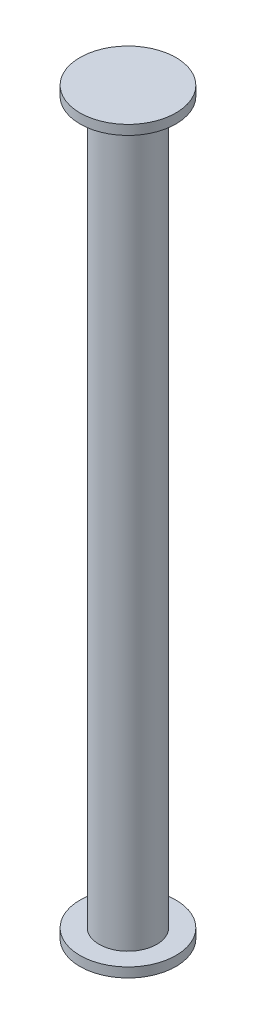
ISO-10303-21;
HEADER;
FILE_DESCRIPTION(('STEP AP214'),'2;1');
FILE_NAME('part.step','',(''),(''),'','','');
FILE_SCHEMA(('AUTOMOTIVE_DESIGN { 1 0 10303 214 1 1 1 1 }'));
ENDSEC;
DATA;
#1=APPLICATION_CONTEXT('core data for automotive mechanical design processes');
#2=APPLICATION_PROTOCOL_DEFINITION('international standard','automotive_design',2000,#1);
#3=PRODUCT_CONTEXT('',#1,'mechanical');
#4=PRODUCT('Part','Part','',(#3));
#5=PRODUCT_RELATED_PRODUCT_CATEGORY('part','',(#4));
#6=PRODUCT_DEFINITION_FORMATION('','',#4);
#7=PRODUCT_DEFINITION_CONTEXT('part definition',#1,'design');
#8=PRODUCT_DEFINITION('design','',#6,#7);
#9=PRODUCT_DEFINITION_SHAPE('','',#8);
#10=(LENGTH_UNIT() NAMED_UNIT(*) SI_UNIT(.MILLI.,.METRE.));
#11=(NAMED_UNIT(*) PLANE_ANGLE_UNIT() SI_UNIT($,.RADIAN.));
#12=(NAMED_UNIT(*) SI_UNIT($,.STERADIAN.) SOLID_ANGLE_UNIT());
#13=UNCERTAINTY_MEASURE_WITH_UNIT(LENGTH_MEASURE(1.E-05),#10,'distance_accuracy_value','');
#14=(GEOMETRIC_REPRESENTATION_CONTEXT(3) GLOBAL_UNCERTAINTY_ASSIGNED_CONTEXT((#13)) GLOBAL_UNIT_ASSIGNED_CONTEXT((#10,
#11,#12)) REPRESENTATION_CONTEXT('',''));
#15=CARTESIAN_POINT('',(0.,0.,0.));
#16=DIRECTION('',(0.,0.,1.));
#17=DIRECTION('',(1.,0.,0.));
#18=AXIS2_PLACEMENT_3D('',#15,#16,#17);
#19=CARTESIAN_POINT('',(0.,0.1,0.));
#20=DIRECTION('',(0.,-1.,0.));
#21=DIRECTION('',(0.,0.,-1.));
#22=AXIS2_PLACEMENT_3D('',#19,#20,#21);
#23=CYLINDRICAL_SURFACE('',#22,0.5);
#24=CARTESIAN_POINT('',(0.,0.1,0.));
#25=DIRECTION('',(0.,1.,0.));
#26=DIRECTION('',(0.,0.,1.));
#27=AXIS2_PLACEMENT_3D('',#24,#25,#26);
#28=CIRCLE('',#27,0.5);
#29=CARTESIAN_POINT('',(0.,0.1,0.5));
#30=VERTEX_POINT('',#29);
#31=EDGE_CURVE('E10',#30,#30,#28,.T.);
#32=ORIENTED_EDGE('',*,*,#31,.F.);
#33=EDGE_LOOP('',(#32));
#34=FACE_BOUND('',#33,.T.);
#35=CARTESIAN_POINT('',(0.,0.,0.));
#36=DIRECTION('',(0.,1.,0.));
#37=DIRECTION('',(0.,0.,1.));
#38=AXIS2_PLACEMENT_3D('',#35,#36,#37);
#39=CIRCLE('',#38,0.5);
#40=CARTESIAN_POINT('',(0.,0.,0.5));
#41=VERTEX_POINT('',#40);
#42=EDGE_CURVE('E34',#41,#41,#39,.T.);
#43=ORIENTED_EDGE('',*,*,#42,.T.);
#44=EDGE_LOOP('',(#43));
#45=FACE_BOUND('',#44,.T.);
#46=ADVANCED_FACE('F31',(#34,#45),#23,.T.);
#47=CARTESIAN_POINT('',(0.,0.1,0.));
#48=DIRECTION('',(0.,1.,0.));
#49=DIRECTION('',(0.,0.,1.));
#50=AXIS2_PLACEMENT_3D('',#47,#48,#49);
#51=PLANE('',#50);
#52=CARTESIAN_POINT('',(0.,0.1,0.));
#53=DIRECTION('',(0.,1.,0.));
#54=DIRECTION('',(0.,0.,1.));
#55=AXIS2_PLACEMENT_3D('',#52,#53,#54);
#56=CIRCLE('',#55,0.3);
#57=CARTESIAN_POINT('',(0.,0.1,0.3));
#58=VERTEX_POINT('',#57);
#59=EDGE_CURVE('E43',#58,#58,#56,.T.);
#60=ORIENTED_EDGE('',*,*,#59,.F.);
#61=EDGE_LOOP('',(#60));
#62=FACE_BOUND('',#61,.T.);
#63=ORIENTED_EDGE('',*,*,#31,.T.);
#64=EDGE_LOOP('',(#63));
#65=FACE_BOUND('',#64,.T.);
#66=ADVANCED_FACE('F73',(#62,#65),#51,.T.);
#67=CARTESIAN_POINT('',(0.,0.,0.));
#68=DIRECTION('',(0.,1.,0.));
#69=DIRECTION('',(0.,0.,1.));
#70=AXIS2_PLACEMENT_3D('',#67,#68,#69);
#71=PLANE('',#70);
#72=ORIENTED_EDGE('',*,*,#42,.F.);
#73=EDGE_LOOP('',(#72));
#74=FACE_BOUND('',#73,.T.);
#75=ADVANCED_FACE('F78',(#74),#71,.F.);
#76=CARTESIAN_POINT('',(0.,7.6,0.));
#77=DIRECTION('',(0.,-1.,0.));
#78=DIRECTION('',(0.,0.,-1.));
#79=AXIS2_PLACEMENT_3D('',#76,#77,#78);
#80=CYLINDRICAL_SURFACE('',#79,0.3);
#81=CARTESIAN_POINT('',(0.,7.6,0.));
#82=DIRECTION('',(0.,1.,0.));
#83=DIRECTION('',(0.,0.,1.));
#84=AXIS2_PLACEMENT_3D('',#81,#82,#83);
#85=CIRCLE('',#84,0.3);
#86=CARTESIAN_POINT('',(0.,7.6,0.3));
#87=VERTEX_POINT('',#86);
#88=EDGE_CURVE('E41',#87,#87,#85,.T.);
#89=ORIENTED_EDGE('',*,*,#88,.F.);
#90=EDGE_LOOP('',(#89));
#91=FACE_BOUND('',#90,.T.);
#92=ORIENTED_EDGE('',*,*,#59,.T.);
#93=EDGE_LOOP('',(#92));
#94=FACE_BOUND('',#93,.T.);
#95=ADVANCED_FACE('F60',(#91,#94),#80,.T.);
#96=CARTESIAN_POINT('',(0.,7.7,0.));
#97=DIRECTION('',(0.,-1.,0.));
#98=DIRECTION('',(0.,0.,-1.));
#99=AXIS2_PLACEMENT_3D('',#96,#97,#98);
#100=CYLINDRICAL_SURFACE('',#99,0.5);
#101=CARTESIAN_POINT('',(0.,7.7,0.));
#102=DIRECTION('',(0.,1.,0.));
#103=DIRECTION('',(0.,0.,1.));
#104=AXIS2_PLACEMENT_3D('',#101,#102,#103);
#105=CIRCLE('',#104,0.5);
#106=CARTESIAN_POINT('',(0.,7.7,0.5));
#107=VERTEX_POINT('',#106);
#108=EDGE_CURVE('E46',#107,#107,#105,.T.);
#109=ORIENTED_EDGE('',*,*,#108,.F.);
#110=EDGE_LOOP('',(#109));
#111=FACE_BOUND('',#110,.T.);
#112=CARTESIAN_POINT('',(0.,7.6,0.));
#113=DIRECTION('',(0.,1.,0.));
#114=DIRECTION('',(0.,0.,1.));
#115=AXIS2_PLACEMENT_3D('',#112,#113,#114);
#116=CIRCLE('',#115,0.5);
#117=CARTESIAN_POINT('',(0.,7.6,0.5));
#118=VERTEX_POINT('',#117);
#119=EDGE_CURVE('E49',#118,#118,#116,.T.);
#120=ORIENTED_EDGE('',*,*,#119,.T.);
#121=EDGE_LOOP('',(#120));
#122=FACE_BOUND('',#121,.T.);
#123=ADVANCED_FACE('F57',(#111,#122),#100,.T.);
#124=CARTESIAN_POINT('',(0.,7.7,0.));
#125=DIRECTION('',(0.,1.,0.));
#126=DIRECTION('',(0.,0.,1.));
#127=AXIS2_PLACEMENT_3D('',#124,#125,#126);
#128=PLANE('',#127);
#129=ORIENTED_EDGE('',*,*,#108,.T.);
#130=EDGE_LOOP('',(#129));
#131=FACE_BOUND('',#130,.T.);
#132=ADVANCED_FACE('F55',(#131),#128,.T.);
#133=CARTESIAN_POINT('',(0.,7.6,0.));
#134=DIRECTION('',(0.,1.,0.));
#135=DIRECTION('',(0.,0.,1.));
#136=AXIS2_PLACEMENT_3D('',#133,#134,#135);
#137=PLANE('',#136);
#138=ORIENTED_EDGE('',*,*,#88,.T.);
#139=EDGE_LOOP('',(#138));
#140=FACE_BOUND('',#139,.T.);
#141=ORIENTED_EDGE('',*,*,#119,.F.);
#142=EDGE_LOOP('',(#141));
#143=FACE_BOUND('',#142,.T.);
#144=ADVANCED_FACE('F64',(#140,#143),#137,.F.);
#145=CLOSED_SHELL('',(#46,#66,#75,#95,#123,#132,#144));
#146=MANIFOLD_SOLID_BREP('B2',#145);
#147=ADVANCED_BREP_SHAPE_REPRESENTATION('',(#18,#146),#14);
#148=SHAPE_DEFINITION_REPRESENTATION(#9,#147);
ENDSEC;
END-ISO-10303-21;
